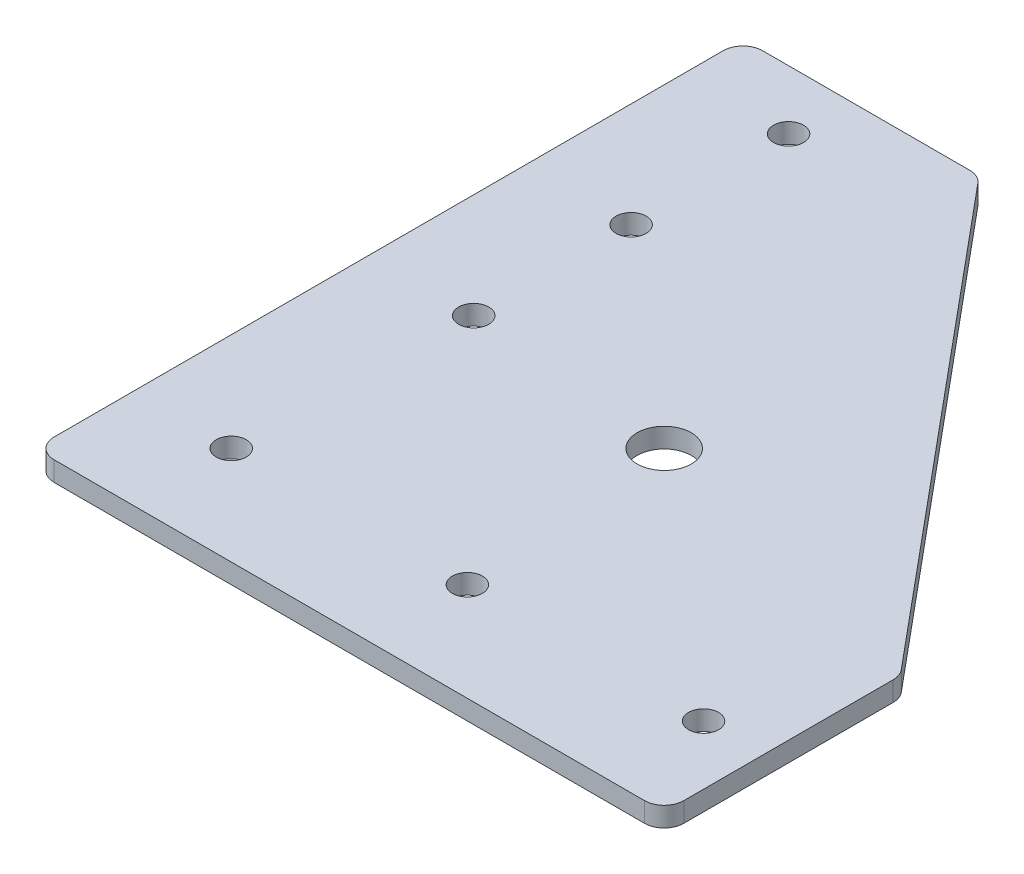
ISO-10303-21;
HEADER;
FILE_DESCRIPTION(('STEP AP214'),'2;1');
FILE_NAME('part.step','',(''),(''),'','','');
FILE_SCHEMA(('AUTOMOTIVE_DESIGN { 1 0 10303 214 1 1 1 1 }'));
ENDSEC;
DATA;
#1=APPLICATION_CONTEXT('core data for automotive mechanical design processes');
#2=APPLICATION_PROTOCOL_DEFINITION('international standard','automotive_design',2000,#1);
#3=PRODUCT_CONTEXT('',#1,'mechanical');
#4=PRODUCT('Part','Part','',(#3));
#5=PRODUCT_RELATED_PRODUCT_CATEGORY('part','',(#4));
#6=PRODUCT_DEFINITION_FORMATION('','',#4);
#7=PRODUCT_DEFINITION_CONTEXT('part definition',#1,'design');
#8=PRODUCT_DEFINITION('design','',#6,#7);
#9=PRODUCT_DEFINITION_SHAPE('','',#8);
#10=(LENGTH_UNIT() NAMED_UNIT(*) SI_UNIT(.MILLI.,.METRE.));
#11=(NAMED_UNIT(*) PLANE_ANGLE_UNIT() SI_UNIT($,.RADIAN.));
#12=(NAMED_UNIT(*) SI_UNIT($,.STERADIAN.) SOLID_ANGLE_UNIT());
#13=UNCERTAINTY_MEASURE_WITH_UNIT(LENGTH_MEASURE(1.E-05),#10,'distance_accuracy_value','');
#14=(GEOMETRIC_REPRESENTATION_CONTEXT(3) GLOBAL_UNCERTAINTY_ASSIGNED_CONTEXT((#13)) GLOBAL_UNIT_ASSIGNED_CONTEXT((#10,
#11,#12)) REPRESENTATION_CONTEXT('',''));
#15=CARTESIAN_POINT('',(0.,0.,0.));
#16=DIRECTION('',(0.,0.,1.));
#17=DIRECTION('',(1.,0.,0.));
#18=AXIS2_PLACEMENT_3D('',#15,#16,#17);
#19=CARTESIAN_POINT('',(0.,3.175,0.));
#20=DIRECTION('',(0.,-1.,0.));
#21=DIRECTION('',(0.,0.,-1.));
#22=AXIS2_PLACEMENT_3D('',#19,#20,#21);
#23=PLANE('',#22);
#24=CARTESIAN_POINT('',(50.8,3.175,-50.8));
#25=DIRECTION('',(0.,-1.,0.));
#26=DIRECTION('',(0.,0.,-1.));
#27=AXIS2_PLACEMENT_3D('',#24,#25,#26);
#28=CIRCLE('',#27,4.3688);
#29=CARTESIAN_POINT('',(50.8,3.175,-55.1688));
#30=VERTEX_POINT('',#29);
#31=EDGE_CURVE('E238',#30,#30,#28,.T.);
#32=ORIENTED_EDGE('',*,*,#31,.T.);
#33=EDGE_LOOP('',(#32));
#34=FACE_BOUND('',#33,.T.);
#35=DIRECTION('',(0.,0.,1.));
#36=VECTOR('',#35,1.);
#37=CARTESIAN_POINT('',(0.,3.175,0.));
#38=LINE('',#37,#36);
#39=CARTESIAN_POINT('',(0.,3.175,-111.125));
#40=VERTEX_POINT('',#39);
#41=CARTESIAN_POINT('',(0.,3.175,-3.175));
#42=VERTEX_POINT('',#41);
#43=EDGE_CURVE('E147',#40,#42,#38,.T.);
#44=ORIENTED_EDGE('',*,*,#43,.T.);
#45=CARTESIAN_POINT('',(3.175,3.175,-3.175));
#46=DIRECTION('',(0.,-1.,0.));
#47=DIRECTION('',(0.,0.,-1.));
#48=AXIS2_PLACEMENT_3D('',#45,#46,#47);
#49=CIRCLE('',#48,3.175);
#50=CARTESIAN_POINT('',(3.175,3.175,0.));
#51=VERTEX_POINT('',#50);
#52=EDGE_CURVE('E173',#42,#51,#49,.F.);
#53=ORIENTED_EDGE('',*,*,#52,.T.);
#54=DIRECTION('',(1.,0.,0.));
#55=VECTOR('',#54,1.);
#56=CARTESIAN_POINT('',(101.6,3.175,0.));
#57=LINE('',#56,#55);
#58=CARTESIAN_POINT('',(98.425,3.175,0.));
#59=VERTEX_POINT('',#58);
#60=EDGE_CURVE('E130',#51,#59,#57,.T.);
#61=ORIENTED_EDGE('',*,*,#60,.T.);
#62=CARTESIAN_POINT('',(98.425,3.175,-3.175));
#63=DIRECTION('',(0.,-1.,0.));
#64=DIRECTION('',(0.,0.,-1.));
#65=AXIS2_PLACEMENT_3D('',#62,#63,#64);
#66=CIRCLE('',#65,3.175);
#67=CARTESIAN_POINT('',(101.6,3.175,-3.17500000000001));
#68=VERTEX_POINT('',#67);
#69=EDGE_CURVE('E166',#59,#68,#66,.F.);
#70=ORIENTED_EDGE('',*,*,#69,.T.);
#71=DIRECTION('',(0.,0.,-1.));
#72=VECTOR('',#71,1.);
#73=CARTESIAN_POINT('',(101.6,3.175,-38.1));
#74=LINE('',#73,#72);
#75=CARTESIAN_POINT('',(101.6,3.175,-36.9504914557993));
#76=VERTEX_POINT('',#75);
#77=EDGE_CURVE('E190',#68,#76,#74,.T.);
#78=ORIENTED_EDGE('',*,*,#77,.T.);
#79=CARTESIAN_POINT('',(98.425,3.175,-36.9504914557993));
#80=DIRECTION('',(0.,-1.,0.));
#81=DIRECTION('',(0.,0.,-1.));
#82=AXIS2_PLACEMENT_3D('',#79,#80,#81);
#83=CIRCLE('',#82,3.175);
#84=CARTESIAN_POINT('',(100.864102562722,3.175,-38.983076924734));
#85=VERTEX_POINT('',#84);
#86=EDGE_CURVE('E168',#76,#85,#83,.F.);
#87=ORIENTED_EDGE('',*,*,#86,.T.);
#88=DIRECTION('',(-0.64018439966448,0.,-0.768221279597376));
#89=VECTOR('',#88,1.);
#90=CARTESIAN_POINT('',(38.1,3.175,-114.3));
#91=LINE('',#90,#89);
#92=CARTESIAN_POINT('',(39.0520121092211,3.175,-113.157585468935));
#93=VERTEX_POINT('',#92);
#94=EDGE_CURVE('E202',#85,#93,#91,.T.);
#95=ORIENTED_EDGE('',*,*,#94,.T.);
#96=CARTESIAN_POINT('',(36.6129095464994,3.175,-111.125));
#97=DIRECTION('',(0.,-1.,0.));
#98=DIRECTION('',(0.,0.,-1.));
#99=AXIS2_PLACEMENT_3D('',#96,#97,#98);
#100=CIRCLE('',#99,3.175);
#101=CARTESIAN_POINT('',(36.6129095464994,3.175,-114.3));
#102=VERTEX_POINT('',#101);
#103=EDGE_CURVE('E54',#93,#102,#100,.F.);
#104=ORIENTED_EDGE('',*,*,#103,.T.);
#105=DIRECTION('',(-1.,0.,0.));
#106=VECTOR('',#105,1.);
#107=CARTESIAN_POINT('',(0.,3.175,-114.3));
#108=LINE('',#107,#106);
#109=CARTESIAN_POINT('',(3.175,3.175,-114.3));
#110=VERTEX_POINT('',#109);
#111=EDGE_CURVE('E203',#102,#110,#108,.T.);
#112=ORIENTED_EDGE('',*,*,#111,.T.);
#113=CARTESIAN_POINT('',(3.175,3.175,-111.125));
#114=DIRECTION('',(0.,-1.,0.));
#115=DIRECTION('',(0.,0.,-1.));
#116=AXIS2_PLACEMENT_3D('',#113,#114,#115);
#117=CIRCLE('',#116,3.175);
#118=EDGE_CURVE('E171',#110,#40,#117,.F.);
#119=ORIENTED_EDGE('',*,*,#118,.T.);
#120=EDGE_LOOP('',(#44,#53,#61,#70,#78,#87,#95,#104,#112,#119));
#121=FACE_BOUND('',#120,.T.);
#122=CARTESIAN_POINT('',(15.875,3.175,-15.875));
#123=DIRECTION('',(0.,1.,0.));
#124=DIRECTION('',(0.,0.,1.));
#125=AXIS2_PLACEMENT_3D('',#122,#123,#124);
#126=CIRCLE('',#125,2.4257);
#127=CARTESIAN_POINT('',(15.875,3.175,-13.4493));
#128=VERTEX_POINT('',#127);
#129=EDGE_CURVE('E138',#128,#128,#126,.T.);
#130=ORIENTED_EDGE('',*,*,#129,.F.);
#131=EDGE_LOOP('',(#130));
#132=FACE_BOUND('',#131,.T.);
#133=CARTESIAN_POINT('',(53.975,3.175,-15.875));
#134=DIRECTION('',(0.,1.,0.));
#135=DIRECTION('',(0.,0.,1.));
#136=AXIS2_PLACEMENT_3D('',#133,#134,#135);
#137=CIRCLE('',#136,2.4257);
#138=CARTESIAN_POINT('',(53.975,3.175,-13.4493));
#139=VERTEX_POINT('',#138);
#140=EDGE_CURVE('E209',#139,#139,#137,.T.);
#141=ORIENTED_EDGE('',*,*,#140,.F.);
#142=EDGE_LOOP('',(#141));
#143=FACE_BOUND('',#142,.T.);
#144=CARTESIAN_POINT('',(92.075,3.175,-15.875));
#145=DIRECTION('',(0.,1.,0.));
#146=DIRECTION('',(0.,0.,1.));
#147=AXIS2_PLACEMENT_3D('',#144,#145,#146);
#148=CIRCLE('',#147,2.4257);
#149=CARTESIAN_POINT('',(92.075,3.175,-13.4493));
#150=VERTEX_POINT('',#149);
#151=EDGE_CURVE('E214',#150,#150,#148,.T.);
#152=ORIENTED_EDGE('',*,*,#151,.F.);
#153=EDGE_LOOP('',(#152));
#154=FACE_BOUND('',#153,.T.);
#155=CARTESIAN_POINT('',(16.891,3.175,-53.975));
#156=DIRECTION('',(0.,1.,0.));
#157=DIRECTION('',(0.,0.,1.));
#158=AXIS2_PLACEMENT_3D('',#155,#156,#157);
#159=CIRCLE('',#158,2.4257);
#160=CARTESIAN_POINT('',(16.891,3.175,-51.5493));
#161=VERTEX_POINT('',#160);
#162=EDGE_CURVE('E220',#161,#161,#159,.T.);
#163=ORIENTED_EDGE('',*,*,#162,.F.);
#164=EDGE_LOOP('',(#163));
#165=FACE_BOUND('',#164,.T.);
#166=CARTESIAN_POINT('',(16.8909999999999,3.175,-79.375));
#167=DIRECTION('',(0.,1.,0.));
#168=DIRECTION('',(0.,0.,1.));
#169=AXIS2_PLACEMENT_3D('',#166,#167,#168);
#170=CIRCLE('',#169,2.4257);
#171=CARTESIAN_POINT('',(16.8909999999999,3.175,-76.9493));
#172=VERTEX_POINT('',#171);
#173=EDGE_CURVE('E226',#172,#172,#170,.T.);
#174=ORIENTED_EDGE('',*,*,#173,.F.);
#175=EDGE_LOOP('',(#174));
#176=FACE_BOUND('',#175,.T.);
#177=CARTESIAN_POINT('',(16.8909999999998,3.175,-104.775));
#178=DIRECTION('',(0.,1.,0.));
#179=DIRECTION('',(0.,0.,1.));
#180=AXIS2_PLACEMENT_3D('',#177,#178,#179);
#181=CIRCLE('',#180,2.4257);
#182=CARTESIAN_POINT('',(16.8909999999998,3.175,-102.3493));
#183=VERTEX_POINT('',#182);
#184=EDGE_CURVE('E232',#183,#183,#181,.T.);
#185=ORIENTED_EDGE('',*,*,#184,.F.);
#186=EDGE_LOOP('',(#185));
#187=FACE_BOUND('',#186,.T.);
#188=ADVANCED_FACE('F32',(#34,#121,#132,#143,#154,#165,#176,#187),#23,.F.);
#189=CARTESIAN_POINT('',(0.,0.,0.));
#190=DIRECTION('',(0.,-1.,0.));
#191=DIRECTION('',(0.,0.,-1.));
#192=AXIS2_PLACEMENT_3D('',#189,#190,#191);
#193=PLANE('',#192);
#194=CARTESIAN_POINT('',(50.8,0.,-50.8));
#195=DIRECTION('',(0.,-1.,0.));
#196=DIRECTION('',(0.,0.,-1.));
#197=AXIS2_PLACEMENT_3D('',#194,#195,#196);
#198=CIRCLE('',#197,4.3688);
#199=CARTESIAN_POINT('',(50.8,0.,-55.1688));
#200=VERTEX_POINT('',#199);
#201=EDGE_CURVE('E241',#200,#200,#198,.T.);
#202=ORIENTED_EDGE('',*,*,#201,.F.);
#203=EDGE_LOOP('',(#202));
#204=FACE_BOUND('',#203,.T.);
#205=CARTESIAN_POINT('',(16.8909999999999,0.,-79.375));
#206=DIRECTION('',(0.,1.,0.));
#207=DIRECTION('',(0.,0.,1.));
#208=AXIS2_PLACEMENT_3D('',#205,#206,#207);
#209=CIRCLE('',#208,2.4257);
#210=CARTESIAN_POINT('',(16.8909999999999,0.,-76.9493));
#211=VERTEX_POINT('',#210);
#212=EDGE_CURVE('E229',#211,#211,#209,.T.);
#213=ORIENTED_EDGE('',*,*,#212,.T.);
#214=EDGE_LOOP('',(#213));
#215=FACE_BOUND('',#214,.T.);
#216=CARTESIAN_POINT('',(92.075,0.,-15.875));
#217=DIRECTION('',(0.,1.,0.));
#218=DIRECTION('',(0.,0.,1.));
#219=AXIS2_PLACEMENT_3D('',#216,#217,#218);
#220=CIRCLE('',#219,2.4257);
#221=CARTESIAN_POINT('',(92.075,0.,-13.4493));
#222=VERTEX_POINT('',#221);
#223=EDGE_CURVE('E217',#222,#222,#220,.T.);
#224=ORIENTED_EDGE('',*,*,#223,.T.);
#225=EDGE_LOOP('',(#224));
#226=FACE_BOUND('',#225,.T.);
#227=CARTESIAN_POINT('',(15.875,0.,-15.875));
#228=DIRECTION('',(0.,1.,0.));
#229=DIRECTION('',(0.,0.,1.));
#230=AXIS2_PLACEMENT_3D('',#227,#228,#229);
#231=CIRCLE('',#230,2.4257);
#232=CARTESIAN_POINT('',(15.875,0.,-13.4493));
#233=VERTEX_POINT('',#232);
#234=EDGE_CURVE('E144',#233,#233,#231,.T.);
#235=ORIENTED_EDGE('',*,*,#234,.T.);
#236=EDGE_LOOP('',(#235));
#237=FACE_BOUND('',#236,.T.);
#238=DIRECTION('',(1.,0.,0.));
#239=VECTOR('',#238,1.);
#240=CARTESIAN_POINT('',(101.6,0.,0.));
#241=LINE('',#240,#239);
#242=CARTESIAN_POINT('',(3.175,0.,0.));
#243=VERTEX_POINT('',#242);
#244=CARTESIAN_POINT('',(98.425,0.,0.));
#245=VERTEX_POINT('',#244);
#246=EDGE_CURVE('E127',#243,#245,#241,.T.);
#247=ORIENTED_EDGE('',*,*,#246,.F.);
#248=CARTESIAN_POINT('',(3.175,0.,-3.175));
#249=DIRECTION('',(0.,-1.,0.));
#250=DIRECTION('',(0.,0.,-1.));
#251=AXIS2_PLACEMENT_3D('',#248,#249,#250);
#252=CIRCLE('',#251,3.175);
#253=CARTESIAN_POINT('',(0.,0.,-3.175));
#254=VERTEX_POINT('',#253);
#255=EDGE_CURVE('E110',#243,#254,#252,.T.);
#256=ORIENTED_EDGE('',*,*,#255,.T.);
#257=DIRECTION('',(0.,0.,1.));
#258=VECTOR('',#257,1.);
#259=CARTESIAN_POINT('',(0.,0.,0.));
#260=LINE('',#259,#258);
#261=CARTESIAN_POINT('',(0.,0.,-111.125));
#262=VERTEX_POINT('',#261);
#263=EDGE_CURVE('E154',#262,#254,#260,.T.);
#264=ORIENTED_EDGE('',*,*,#263,.F.);
#265=CARTESIAN_POINT('',(3.175,0.,-111.125));
#266=DIRECTION('',(0.,-1.,0.));
#267=DIRECTION('',(0.,0.,-1.));
#268=AXIS2_PLACEMENT_3D('',#265,#266,#267);
#269=CIRCLE('',#268,3.175);
#270=CARTESIAN_POINT('',(3.175,0.,-114.3));
#271=VERTEX_POINT('',#270);
#272=EDGE_CURVE('E121',#262,#271,#269,.T.);
#273=ORIENTED_EDGE('',*,*,#272,.T.);
#274=DIRECTION('',(-1.,0.,0.));
#275=VECTOR('',#274,1.);
#276=CARTESIAN_POINT('',(0.,0.,-114.3));
#277=LINE('',#276,#275);
#278=CARTESIAN_POINT('',(36.6129095464994,0.,-114.3));
#279=VERTEX_POINT('',#278);
#280=EDGE_CURVE('E152',#279,#271,#277,.T.);
#281=ORIENTED_EDGE('',*,*,#280,.F.);
#282=CARTESIAN_POINT('',(36.6129095464994,0.,-111.125));
#283=DIRECTION('',(0.,-1.,0.));
#284=DIRECTION('',(0.,0.,-1.));
#285=AXIS2_PLACEMENT_3D('',#282,#283,#284);
#286=CIRCLE('',#285,3.175);
#287=CARTESIAN_POINT('',(39.0520121092211,0.,-113.157585468935));
#288=VERTEX_POINT('',#287);
#289=EDGE_CURVE('E160',#279,#288,#286,.T.);
#290=ORIENTED_EDGE('',*,*,#289,.T.);
#291=DIRECTION('',(-0.64018439966448,0.,-0.768221279597376));
#292=VECTOR('',#291,1.);
#293=CARTESIAN_POINT('',(38.1,0.,-114.3));
#294=LINE('',#293,#292);
#295=CARTESIAN_POINT('',(100.864102562722,0.,-38.983076924734));
#296=VERTEX_POINT('',#295);
#297=EDGE_CURVE('E141',#296,#288,#294,.T.);
#298=ORIENTED_EDGE('',*,*,#297,.F.);
#299=CARTESIAN_POINT('',(98.425,0.,-36.9504914557993));
#300=DIRECTION('',(0.,-1.,0.));
#301=DIRECTION('',(0.,0.,-1.));
#302=AXIS2_PLACEMENT_3D('',#299,#300,#301);
#303=CIRCLE('',#302,3.175);
#304=CARTESIAN_POINT('',(101.6,0.,-36.9504914557993));
#305=VERTEX_POINT('',#304);
#306=EDGE_CURVE('E158',#296,#305,#303,.T.);
#307=ORIENTED_EDGE('',*,*,#306,.T.);
#308=DIRECTION('',(0.,0.,-1.));
#309=VECTOR('',#308,1.);
#310=CARTESIAN_POINT('',(101.6,0.,-38.1));
#311=LINE('',#310,#309);
#312=CARTESIAN_POINT('',(101.6,0.,-3.17500000000001));
#313=VERTEX_POINT('',#312);
#314=EDGE_CURVE('E137',#313,#305,#311,.T.);
#315=ORIENTED_EDGE('',*,*,#314,.F.);
#316=CARTESIAN_POINT('',(98.425,0.,-3.175));
#317=DIRECTION('',(0.,-1.,0.));
#318=DIRECTION('',(0.,0.,-1.));
#319=AXIS2_PLACEMENT_3D('',#316,#317,#318);
#320=CIRCLE('',#319,3.175);
#321=EDGE_CURVE('E131',#313,#245,#320,.T.);
#322=ORIENTED_EDGE('',*,*,#321,.T.);
#323=EDGE_LOOP('',(#247,#256,#264,#273,#281,#290,#298,#307,#315,#322));
#324=FACE_BOUND('',#323,.T.);
#325=CARTESIAN_POINT('',(53.975,0.,-15.875));
#326=DIRECTION('',(0.,1.,0.));
#327=DIRECTION('',(0.,0.,1.));
#328=AXIS2_PLACEMENT_3D('',#325,#326,#327);
#329=CIRCLE('',#328,2.4257);
#330=CARTESIAN_POINT('',(53.975,0.,-13.4493));
#331=VERTEX_POINT('',#330);
#332=EDGE_CURVE('E211',#331,#331,#329,.T.);
#333=ORIENTED_EDGE('',*,*,#332,.T.);
#334=EDGE_LOOP('',(#333));
#335=FACE_BOUND('',#334,.T.);
#336=CARTESIAN_POINT('',(16.891,0.,-53.975));
#337=DIRECTION('',(0.,1.,0.));
#338=DIRECTION('',(0.,0.,1.));
#339=AXIS2_PLACEMENT_3D('',#336,#337,#338);
#340=CIRCLE('',#339,2.4257);
#341=CARTESIAN_POINT('',(16.891,0.,-51.5493));
#342=VERTEX_POINT('',#341);
#343=EDGE_CURVE('E223',#342,#342,#340,.T.);
#344=ORIENTED_EDGE('',*,*,#343,.T.);
#345=EDGE_LOOP('',(#344));
#346=FACE_BOUND('',#345,.T.);
#347=CARTESIAN_POINT('',(16.8909999999998,0.,-104.775));
#348=DIRECTION('',(0.,1.,0.));
#349=DIRECTION('',(0.,0.,1.));
#350=AXIS2_PLACEMENT_3D('',#347,#348,#349);
#351=CIRCLE('',#350,2.4257);
#352=CARTESIAN_POINT('',(16.8909999999998,0.,-102.3493));
#353=VERTEX_POINT('',#352);
#354=EDGE_CURVE('E235',#353,#353,#351,.T.);
#355=ORIENTED_EDGE('',*,*,#354,.T.);
#356=EDGE_LOOP('',(#355));
#357=FACE_BOUND('',#356,.T.);
#358=ADVANCED_FACE('F134',(#204,#215,#226,#237,#324,#335,#346,#357),#193,.T.);
#359=CARTESIAN_POINT('',(101.6,3.175,0.));
#360=DIRECTION('',(0.,0.,-1.));
#361=DIRECTION('',(-1.,0.,0.));
#362=AXIS2_PLACEMENT_3D('',#359,#360,#361);
#363=PLANE('',#362);
#364=ORIENTED_EDGE('',*,*,#60,.F.);
#365=DIRECTION('',(0.,-1.,0.));
#366=VECTOR('',#365,1.);
#367=CARTESIAN_POINT('',(3.175,3.175,0.));
#368=LINE('',#367,#366);
#369=EDGE_CURVE('E114',#51,#243,#368,.T.);
#370=ORIENTED_EDGE('',*,*,#369,.T.);
#371=ORIENTED_EDGE('',*,*,#246,.T.);
#372=DIRECTION('',(0.,-1.,0.));
#373=VECTOR('',#372,1.);
#374=CARTESIAN_POINT('',(98.425,3.175,0.));
#375=LINE('',#374,#373);
#376=EDGE_CURVE('E132',#245,#59,#375,.F.);
#377=ORIENTED_EDGE('',*,*,#376,.T.);
#378=EDGE_LOOP('',(#364,#370,#371,#377));
#379=FACE_BOUND('',#378,.T.);
#380=ADVANCED_FACE('F126',(#379),#363,.F.);
#381=CARTESIAN_POINT('',(101.6,3.175,-38.1));
#382=DIRECTION('',(-1.,0.,0.));
#383=DIRECTION('',(0.,0.,1.));
#384=AXIS2_PLACEMENT_3D('',#381,#382,#383);
#385=PLANE('',#384);
#386=ORIENTED_EDGE('',*,*,#314,.T.);
#387=DIRECTION('',(0.,-1.,0.));
#388=VECTOR('',#387,1.);
#389=CARTESIAN_POINT('',(101.6,3.175,-36.9504914557993));
#390=LINE('',#389,#388);
#391=EDGE_CURVE('E11',#305,#76,#390,.F.);
#392=ORIENTED_EDGE('',*,*,#391,.T.);
#393=ORIENTED_EDGE('',*,*,#77,.F.);
#394=DIRECTION('',(0.,-1.,0.));
#395=VECTOR('',#394,1.);
#396=CARTESIAN_POINT('',(101.6,3.175,-3.175));
#397=LINE('',#396,#395);
#398=EDGE_CURVE('E40',#68,#313,#397,.T.);
#399=ORIENTED_EDGE('',*,*,#398,.T.);
#400=EDGE_LOOP('',(#386,#392,#393,#399));
#401=FACE_BOUND('',#400,.T.);
#402=ADVANCED_FACE('F187',(#401),#385,.F.);
#403=CARTESIAN_POINT('',(38.1,3.175,-114.3));
#404=DIRECTION('',(-0.768221279597376,0.,0.64018439966448));
#405=DIRECTION('',(0.64018439966448,0.,0.768221279597376));
#406=AXIS2_PLACEMENT_3D('',#403,#404,#405);
#407=PLANE('',#406);
#408=ORIENTED_EDGE('',*,*,#297,.T.);
#409=DIRECTION('',(0.,-1.,0.));
#410=VECTOR('',#409,1.);
#411=CARTESIAN_POINT('',(39.0520121092211,3.175,-113.157585468935));
#412=LINE('',#411,#410);
#413=EDGE_CURVE('E182',#288,#93,#412,.F.);
#414=ORIENTED_EDGE('',*,*,#413,.T.);
#415=ORIENTED_EDGE('',*,*,#94,.F.);
#416=DIRECTION('',(0.,-1.,0.));
#417=VECTOR('',#416,1.);
#418=CARTESIAN_POINT('',(100.864102562722,3.175,-38.983076924734));
#419=LINE('',#418,#417);
#420=EDGE_CURVE('E179',#85,#296,#419,.T.);
#421=ORIENTED_EDGE('',*,*,#420,.T.);
#422=EDGE_LOOP('',(#408,#414,#415,#421));
#423=FACE_BOUND('',#422,.T.);
#424=ADVANCED_FACE('F200',(#423),#407,.F.);
#425=CARTESIAN_POINT('',(0.,3.175,-114.3));
#426=DIRECTION('',(0.,0.,1.));
#427=DIRECTION('',(1.,0.,0.));
#428=AXIS2_PLACEMENT_3D('',#425,#426,#427);
#429=PLANE('',#428);
#430=ORIENTED_EDGE('',*,*,#280,.T.);
#431=DIRECTION('',(0.,-1.,0.));
#432=VECTOR('',#431,1.);
#433=CARTESIAN_POINT('',(3.175,3.175,-114.3));
#434=LINE('',#433,#432);
#435=EDGE_CURVE('E47',#271,#110,#434,.F.);
#436=ORIENTED_EDGE('',*,*,#435,.T.);
#437=ORIENTED_EDGE('',*,*,#111,.F.);
#438=DIRECTION('',(0.,-1.,0.));
#439=VECTOR('',#438,1.);
#440=CARTESIAN_POINT('',(36.6129095464994,3.175,-114.3));
#441=LINE('',#440,#439);
#442=EDGE_CURVE('E175',#102,#279,#441,.T.);
#443=ORIENTED_EDGE('',*,*,#442,.T.);
#444=EDGE_LOOP('',(#430,#436,#437,#443));
#445=FACE_BOUND('',#444,.T.);
#446=ADVANCED_FACE('F276',(#445),#429,.F.);
#447=CARTESIAN_POINT('',(0.,3.175,0.));
#448=DIRECTION('',(1.,0.,0.));
#449=DIRECTION('',(0.,0.,-1.));
#450=AXIS2_PLACEMENT_3D('',#447,#448,#449);
#451=PLANE('',#450);
#452=ORIENTED_EDGE('',*,*,#263,.T.);
#453=DIRECTION('',(0.,-1.,0.));
#454=VECTOR('',#453,1.);
#455=CARTESIAN_POINT('',(0.,3.175,-3.175));
#456=LINE('',#455,#454);
#457=EDGE_CURVE('E115',#254,#42,#456,.F.);
#458=ORIENTED_EDGE('',*,*,#457,.T.);
#459=ORIENTED_EDGE('',*,*,#43,.F.);
#460=DIRECTION('',(0.,-1.,0.));
#461=VECTOR('',#460,1.);
#462=CARTESIAN_POINT('',(0.,3.175,-111.125));
#463=LINE('',#462,#461);
#464=EDGE_CURVE('E120',#40,#262,#463,.T.);
#465=ORIENTED_EDGE('',*,*,#464,.T.);
#466=EDGE_LOOP('',(#452,#458,#459,#465));
#467=FACE_BOUND('',#466,.T.);
#468=ADVANCED_FACE('F266',(#467),#451,.F.);
#469=CARTESIAN_POINT('',(15.875,3.175,-15.875));
#470=DIRECTION('',(0.,-1.,0.));
#471=DIRECTION('',(0.,0.,-1.));
#472=AXIS2_PLACEMENT_3D('',#469,#470,#471);
#473=CYLINDRICAL_SURFACE('',#472,2.4257);
#474=ORIENTED_EDGE('',*,*,#129,.T.);
#475=EDGE_LOOP('',(#474));
#476=FACE_BOUND('',#475,.T.);
#477=ORIENTED_EDGE('',*,*,#234,.F.);
#478=EDGE_LOOP('',(#477));
#479=FACE_BOUND('',#478,.T.);
#480=ADVANCED_FACE('F263',(#476,#479),#473,.F.);
#481=CARTESIAN_POINT('',(53.975,3.175,-15.875));
#482=DIRECTION('',(0.,-1.,0.));
#483=DIRECTION('',(0.,0.,-1.));
#484=AXIS2_PLACEMENT_3D('',#481,#482,#483);
#485=CYLINDRICAL_SURFACE('',#484,2.4257);
#486=ORIENTED_EDGE('',*,*,#140,.T.);
#487=EDGE_LOOP('',(#486));
#488=FACE_BOUND('',#487,.T.);
#489=ORIENTED_EDGE('',*,*,#332,.F.);
#490=EDGE_LOOP('',(#489));
#491=FACE_BOUND('',#490,.T.);
#492=ADVANCED_FACE('F265',(#488,#491),#485,.F.);
#493=CARTESIAN_POINT('',(92.075,3.175,-15.875));
#494=DIRECTION('',(0.,-1.,0.));
#495=DIRECTION('',(0.,0.,-1.));
#496=AXIS2_PLACEMENT_3D('',#493,#494,#495);
#497=CYLINDRICAL_SURFACE('',#496,2.4257);
#498=ORIENTED_EDGE('',*,*,#151,.T.);
#499=EDGE_LOOP('',(#498));
#500=FACE_BOUND('',#499,.T.);
#501=ORIENTED_EDGE('',*,*,#223,.F.);
#502=EDGE_LOOP('',(#501));
#503=FACE_BOUND('',#502,.T.);
#504=ADVANCED_FACE('F273',(#500,#503),#497,.F.);
#505=CARTESIAN_POINT('',(16.891,3.175,-53.975));
#506=DIRECTION('',(0.,-1.,0.));
#507=DIRECTION('',(0.,0.,-1.));
#508=AXIS2_PLACEMENT_3D('',#505,#506,#507);
#509=CYLINDRICAL_SURFACE('',#508,2.4257);
#510=ORIENTED_EDGE('',*,*,#162,.T.);
#511=EDGE_LOOP('',(#510));
#512=FACE_BOUND('',#511,.T.);
#513=ORIENTED_EDGE('',*,*,#343,.F.);
#514=EDGE_LOOP('',(#513));
#515=FACE_BOUND('',#514,.T.);
#516=ADVANCED_FACE('F336',(#512,#515),#509,.F.);
#517=CARTESIAN_POINT('',(16.8909999999999,3.175,-79.375));
#518=DIRECTION('',(0.,-1.,0.));
#519=DIRECTION('',(0.,0.,-1.));
#520=AXIS2_PLACEMENT_3D('',#517,#518,#519);
#521=CYLINDRICAL_SURFACE('',#520,2.4257);
#522=ORIENTED_EDGE('',*,*,#173,.T.);
#523=EDGE_LOOP('',(#522));
#524=FACE_BOUND('',#523,.T.);
#525=ORIENTED_EDGE('',*,*,#212,.F.);
#526=EDGE_LOOP('',(#525));
#527=FACE_BOUND('',#526,.T.);
#528=ADVANCED_FACE('F329',(#524,#527),#521,.F.);
#529=CARTESIAN_POINT('',(16.8909999999998,3.175,-104.775));
#530=DIRECTION('',(0.,-1.,0.));
#531=DIRECTION('',(0.,0.,-1.));
#532=AXIS2_PLACEMENT_3D('',#529,#530,#531);
#533=CYLINDRICAL_SURFACE('',#532,2.4257);
#534=ORIENTED_EDGE('',*,*,#184,.T.);
#535=EDGE_LOOP('',(#534));
#536=FACE_BOUND('',#535,.T.);
#537=ORIENTED_EDGE('',*,*,#354,.F.);
#538=EDGE_LOOP('',(#537));
#539=FACE_BOUND('',#538,.T.);
#540=ADVANCED_FACE('F295',(#536,#539),#533,.F.);
#541=CARTESIAN_POINT('',(3.175,3.175,-3.175));
#542=DIRECTION('',(0.,-1.,0.));
#543=DIRECTION('',(0.,0.,-1.));
#544=AXIS2_PLACEMENT_3D('',#541,#542,#543);
#545=CYLINDRICAL_SURFACE('',#544,3.175);
#546=ORIENTED_EDGE('',*,*,#52,.F.);
#547=ORIENTED_EDGE('',*,*,#457,.F.);
#548=ORIENTED_EDGE('',*,*,#255,.F.);
#549=ORIENTED_EDGE('',*,*,#369,.F.);
#550=EDGE_LOOP('',(#546,#547,#548,#549));
#551=FACE_BOUND('',#550,.T.);
#552=ADVANCED_FACE('F113',(#551),#545,.T.);
#553=CARTESIAN_POINT('',(3.175,3.175,-111.125));
#554=DIRECTION('',(0.,-1.,0.));
#555=DIRECTION('',(0.,0.,-1.));
#556=AXIS2_PLACEMENT_3D('',#553,#554,#555);
#557=CYLINDRICAL_SURFACE('',#556,3.175);
#558=ORIENTED_EDGE('',*,*,#118,.F.);
#559=ORIENTED_EDGE('',*,*,#435,.F.);
#560=ORIENTED_EDGE('',*,*,#272,.F.);
#561=ORIENTED_EDGE('',*,*,#464,.F.);
#562=EDGE_LOOP('',(#558,#559,#560,#561));
#563=FACE_BOUND('',#562,.T.);
#564=ADVANCED_FACE('F294',(#563),#557,.T.);
#565=CARTESIAN_POINT('',(36.6129095464994,3.175,-111.125));
#566=DIRECTION('',(0.,-1.,0.));
#567=DIRECTION('',(0.,0.,-1.));
#568=AXIS2_PLACEMENT_3D('',#565,#566,#567);
#569=CYLINDRICAL_SURFACE('',#568,3.175);
#570=ORIENTED_EDGE('',*,*,#103,.F.);
#571=ORIENTED_EDGE('',*,*,#413,.F.);
#572=ORIENTED_EDGE('',*,*,#289,.F.);
#573=ORIENTED_EDGE('',*,*,#442,.F.);
#574=EDGE_LOOP('',(#570,#571,#572,#573));
#575=FACE_BOUND('',#574,.T.);
#576=ADVANCED_FACE('F298',(#575),#569,.T.);
#577=CARTESIAN_POINT('',(98.425,3.175,-36.9504914557993));
#578=DIRECTION('',(0.,-1.,0.));
#579=DIRECTION('',(0.,0.,-1.));
#580=AXIS2_PLACEMENT_3D('',#577,#578,#579);
#581=CYLINDRICAL_SURFACE('',#580,3.175);
#582=ORIENTED_EDGE('',*,*,#86,.F.);
#583=ORIENTED_EDGE('',*,*,#391,.F.);
#584=ORIENTED_EDGE('',*,*,#306,.F.);
#585=ORIENTED_EDGE('',*,*,#420,.F.);
#586=EDGE_LOOP('',(#582,#583,#584,#585));
#587=FACE_BOUND('',#586,.T.);
#588=ADVANCED_FACE('F197',(#587),#581,.T.);
#589=CARTESIAN_POINT('',(98.425,3.175,-3.175));
#590=DIRECTION('',(0.,-1.,0.));
#591=DIRECTION('',(0.,0.,-1.));
#592=AXIS2_PLACEMENT_3D('',#589,#590,#591);
#593=CYLINDRICAL_SURFACE('',#592,3.175);
#594=ORIENTED_EDGE('',*,*,#69,.F.);
#595=ORIENTED_EDGE('',*,*,#376,.F.);
#596=ORIENTED_EDGE('',*,*,#321,.F.);
#597=ORIENTED_EDGE('',*,*,#398,.F.);
#598=EDGE_LOOP('',(#594,#595,#596,#597));
#599=FACE_BOUND('',#598,.T.);
#600=ADVANCED_FACE('F34',(#599),#593,.T.);
#601=CARTESIAN_POINT('',(50.8,3.175,-50.8));
#602=DIRECTION('',(0.,-1.,0.));
#603=DIRECTION('',(0.,0.,-1.));
#604=AXIS2_PLACEMENT_3D('',#601,#602,#603);
#605=CYLINDRICAL_SURFACE('',#604,4.3688);
#606=ORIENTED_EDGE('',*,*,#31,.F.);
#607=EDGE_LOOP('',(#606));
#608=FACE_BOUND('',#607,.T.);
#609=ORIENTED_EDGE('',*,*,#201,.T.);
#610=EDGE_LOOP('',(#609));
#611=FACE_BOUND('',#610,.T.);
#612=ADVANCED_FACE('F248',(#608,#611),#605,.F.);
#613=CLOSED_SHELL('',(#188,#358,#380,#402,#424,#446,#468,#480,#492,#504,#516,#528,#540,#552,
#564,#576,#588,#600,#612));
#614=MANIFOLD_SOLID_BREP('B2',#613);
#615=ADVANCED_BREP_SHAPE_REPRESENTATION('',(#18,#614),#14);
#616=SHAPE_DEFINITION_REPRESENTATION(#9,#615);
ENDSEC;
END-ISO-10303-21;
